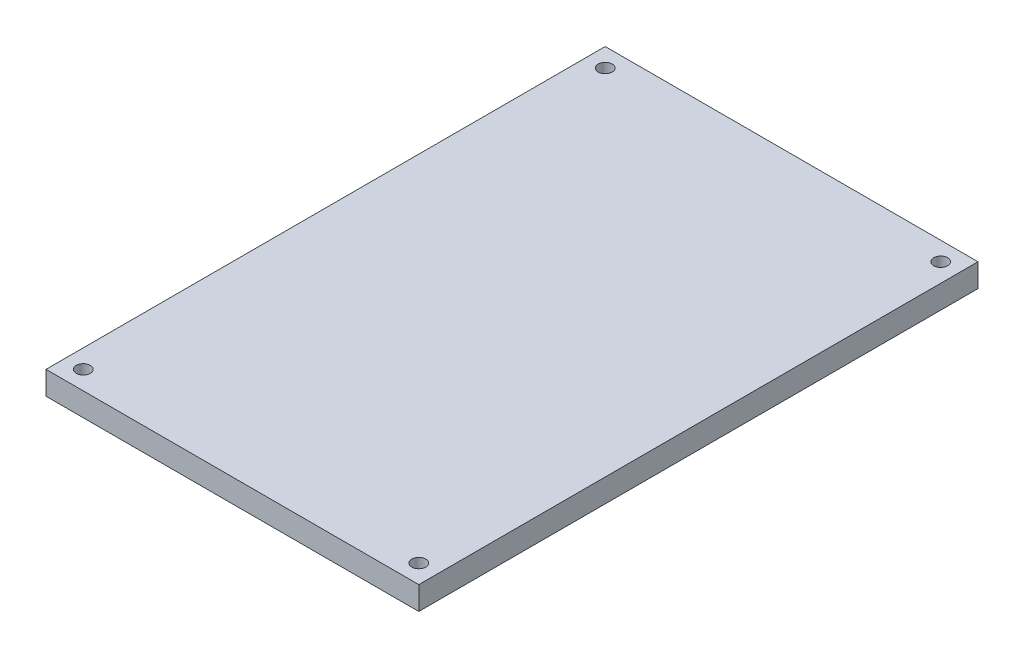
ISO-10303-21;
HEADER;
FILE_DESCRIPTION(('STEP AP214'),'2;1');
FILE_NAME('part.step','',(''),(''),'','','');
FILE_SCHEMA(('AUTOMOTIVE_DESIGN { 1 0 10303 214 1 1 1 1 }'));
ENDSEC;
DATA;
#1=APPLICATION_CONTEXT('core data for automotive mechanical design processes');
#2=APPLICATION_PROTOCOL_DEFINITION('international standard','automotive_design',2000,#1);
#3=PRODUCT_CONTEXT('',#1,'mechanical');
#4=PRODUCT('Part','Part','',(#3));
#5=PRODUCT_RELATED_PRODUCT_CATEGORY('part','',(#4));
#6=PRODUCT_DEFINITION_FORMATION('','',#4);
#7=PRODUCT_DEFINITION_CONTEXT('part definition',#1,'design');
#8=PRODUCT_DEFINITION('design','',#6,#7);
#9=PRODUCT_DEFINITION_SHAPE('','',#8);
#10=(LENGTH_UNIT() NAMED_UNIT(*) SI_UNIT(.MILLI.,.METRE.));
#11=(NAMED_UNIT(*) PLANE_ANGLE_UNIT() SI_UNIT($,.RADIAN.));
#12=(NAMED_UNIT(*) SI_UNIT($,.STERADIAN.) SOLID_ANGLE_UNIT());
#13=UNCERTAINTY_MEASURE_WITH_UNIT(LENGTH_MEASURE(1.E-05),#10,'distance_accuracy_value','');
#14=(GEOMETRIC_REPRESENTATION_CONTEXT(3) GLOBAL_UNCERTAINTY_ASSIGNED_CONTEXT((#13)) GLOBAL_UNIT_ASSIGNED_CONTEXT((#10,
#11,#12)) REPRESENTATION_CONTEXT('',''));
#15=CARTESIAN_POINT('',(0.,0.,0.));
#16=DIRECTION('',(0.,0.,1.));
#17=DIRECTION('',(1.,0.,0.));
#18=AXIS2_PLACEMENT_3D('',#15,#16,#17);
#19=CARTESIAN_POINT('',(0.,5.,0.));
#20=DIRECTION('',(0.,1.,0.));
#21=DIRECTION('',(0.,0.,1.));
#22=AXIS2_PLACEMENT_3D('',#19,#20,#21);
#23=PLANE('',#22);
#24=CARTESIAN_POINT('',(-76.,5.,-4.));
#25=DIRECTION('',(0.,-1.,0.));
#26=DIRECTION('',(0.,0.,-1.));
#27=AXIS2_PLACEMENT_3D('',#24,#25,#26);
#28=CIRCLE('',#27,1.5);
#29=CARTESIAN_POINT('',(-76.,5.,-5.5));
#30=VERTEX_POINT('',#29);
#31=EDGE_CURVE('E124',#30,#30,#28,.T.);
#32=ORIENTED_EDGE('',*,*,#31,.T.);
#33=EDGE_LOOP('',(#32));
#34=FACE_BOUND('',#33,.T.);
#35=CARTESIAN_POINT('',(-4.,5.,-116.));
#36=DIRECTION('',(0.,1.,0.));
#37=DIRECTION('',(0.,0.,1.));
#38=AXIS2_PLACEMENT_3D('',#35,#36,#37);
#39=CIRCLE('',#38,1.5);
#40=CARTESIAN_POINT('',(-4.,5.,-114.5));
#41=VERTEX_POINT('',#40);
#42=EDGE_CURVE('E118',#41,#41,#39,.T.);
#43=ORIENTED_EDGE('',*,*,#42,.F.);
#44=EDGE_LOOP('',(#43));
#45=FACE_BOUND('',#44,.T.);
#46=CARTESIAN_POINT('',(-76.,5.,-116.));
#47=DIRECTION('',(0.,1.,0.));
#48=DIRECTION('',(0.,0.,1.));
#49=AXIS2_PLACEMENT_3D('',#46,#47,#48);
#50=CIRCLE('',#49,1.5);
#51=CARTESIAN_POINT('',(-76.,5.,-114.5));
#52=VERTEX_POINT('',#51);
#53=EDGE_CURVE('E112',#52,#52,#50,.T.);
#54=ORIENTED_EDGE('',*,*,#53,.F.);
#55=EDGE_LOOP('',(#54));
#56=FACE_BOUND('',#55,.T.);
#57=DIRECTION('',(0.,0.,-1.));
#58=VECTOR('',#57,1.);
#59=CARTESIAN_POINT('',(0.,5.,0.));
#60=LINE('',#59,#58);
#61=CARTESIAN_POINT('',(0.,5.,0.));
#62=VERTEX_POINT('',#61);
#63=CARTESIAN_POINT('',(0.,5.,-120.));
#64=VERTEX_POINT('',#63);
#65=EDGE_CURVE('E85',#62,#64,#60,.T.);
#66=ORIENTED_EDGE('',*,*,#65,.T.);
#67=DIRECTION('',(-1.,0.,0.));
#68=VECTOR('',#67,1.);
#69=CARTESIAN_POINT('',(0.,5.,-120.));
#70=LINE('',#69,#68);
#71=CARTESIAN_POINT('',(-80.,5.,-120.));
#72=VERTEX_POINT('',#71);
#73=EDGE_CURVE('E80',#64,#72,#70,.T.);
#74=ORIENTED_EDGE('',*,*,#73,.T.);
#75=DIRECTION('',(0.,0.,1.));
#76=VECTOR('',#75,1.);
#77=CARTESIAN_POINT('',(-80.,5.,0.));
#78=LINE('',#77,#76);
#79=CARTESIAN_POINT('',(-80.,5.,0.));
#80=VERTEX_POINT('',#79);
#81=EDGE_CURVE('E83',#72,#80,#78,.T.);
#82=ORIENTED_EDGE('',*,*,#81,.T.);
#83=DIRECTION('',(1.,0.,0.));
#84=VECTOR('',#83,1.);
#85=CARTESIAN_POINT('',(0.,5.,0.));
#86=LINE('',#85,#84);
#87=EDGE_CURVE('E50',#80,#62,#86,.T.);
#88=ORIENTED_EDGE('',*,*,#87,.T.);
#89=EDGE_LOOP('',(#66,#74,#82,#88));
#90=FACE_BOUND('',#89,.T.);
#91=CARTESIAN_POINT('',(-4.,5.,-4.));
#92=DIRECTION('',(0.,-1.,0.));
#93=DIRECTION('',(0.,0.,-1.));
#94=AXIS2_PLACEMENT_3D('',#91,#92,#93);
#95=CIRCLE('',#94,1.5);
#96=CARTESIAN_POINT('',(-4.,5.,-5.50000000000001));
#97=VERTEX_POINT('',#96);
#98=EDGE_CURVE('E130',#97,#97,#95,.T.);
#99=ORIENTED_EDGE('',*,*,#98,.T.);
#100=EDGE_LOOP('',(#99));
#101=FACE_BOUND('',#100,.T.);
#102=ADVANCED_FACE('F33',(#34,#45,#56,#90,#101),#23,.T.);
#103=CARTESIAN_POINT('',(0.,0.,0.));
#104=DIRECTION('',(0.,1.,0.));
#105=DIRECTION('',(0.,0.,1.));
#106=AXIS2_PLACEMENT_3D('',#103,#104,#105);
#107=PLANE('',#106);
#108=CARTESIAN_POINT('',(-76.,0.,-4.));
#109=DIRECTION('',(0.,-1.,0.));
#110=DIRECTION('',(0.,0.,-1.));
#111=AXIS2_PLACEMENT_3D('',#108,#109,#110);
#112=CIRCLE('',#111,1.5);
#113=CARTESIAN_POINT('',(-76.,0.,-5.5));
#114=VERTEX_POINT('',#113);
#115=EDGE_CURVE('E121',#114,#114,#112,.T.);
#116=ORIENTED_EDGE('',*,*,#115,.F.);
#117=EDGE_LOOP('',(#116));
#118=FACE_BOUND('',#117,.T.);
#119=CARTESIAN_POINT('',(-4.,0.,-116.));
#120=DIRECTION('',(0.,1.,0.));
#121=DIRECTION('',(0.,0.,1.));
#122=AXIS2_PLACEMENT_3D('',#119,#120,#121);
#123=CIRCLE('',#122,1.5);
#124=CARTESIAN_POINT('',(-4.,0.,-114.5));
#125=VERTEX_POINT('',#124);
#126=EDGE_CURVE('E115',#125,#125,#123,.T.);
#127=ORIENTED_EDGE('',*,*,#126,.T.);
#128=EDGE_LOOP('',(#127));
#129=FACE_BOUND('',#128,.T.);
#130=CARTESIAN_POINT('',(-76.,0.,-116.));
#131=DIRECTION('',(0.,1.,0.));
#132=DIRECTION('',(0.,0.,1.));
#133=AXIS2_PLACEMENT_3D('',#130,#131,#132);
#134=CIRCLE('',#133,1.5);
#135=CARTESIAN_POINT('',(-76.,0.,-114.5));
#136=VERTEX_POINT('',#135);
#137=EDGE_CURVE('E100',#136,#136,#134,.T.);
#138=ORIENTED_EDGE('',*,*,#137,.T.);
#139=EDGE_LOOP('',(#138));
#140=FACE_BOUND('',#139,.T.);
#141=DIRECTION('',(0.,0.,-1.));
#142=VECTOR('',#141,1.);
#143=CARTESIAN_POINT('',(0.,0.,0.));
#144=LINE('',#143,#142);
#145=CARTESIAN_POINT('',(0.,0.,0.));
#146=VERTEX_POINT('',#145);
#147=CARTESIAN_POINT('',(0.,0.,-120.));
#148=VERTEX_POINT('',#147);
#149=EDGE_CURVE('E97',#146,#148,#144,.T.);
#150=ORIENTED_EDGE('',*,*,#149,.F.);
#151=DIRECTION('',(1.,0.,0.));
#152=VECTOR('',#151,1.);
#153=CARTESIAN_POINT('',(0.,0.,0.));
#154=LINE('',#153,#152);
#155=CARTESIAN_POINT('',(-80.,0.,0.));
#156=VERTEX_POINT('',#155);
#157=EDGE_CURVE('E73',#156,#146,#154,.T.);
#158=ORIENTED_EDGE('',*,*,#157,.F.);
#159=DIRECTION('',(0.,0.,1.));
#160=VECTOR('',#159,1.);
#161=CARTESIAN_POINT('',(-80.,0.,0.));
#162=LINE('',#161,#160);
#163=CARTESIAN_POINT('',(-80.,0.,-120.));
#164=VERTEX_POINT('',#163);
#165=EDGE_CURVE('E67',#164,#156,#162,.T.);
#166=ORIENTED_EDGE('',*,*,#165,.F.);
#167=DIRECTION('',(-1.,0.,0.));
#168=VECTOR('',#167,1.);
#169=CARTESIAN_POINT('',(0.,0.,-120.));
#170=LINE('',#169,#168);
#171=EDGE_CURVE('E89',#148,#164,#170,.T.);
#172=ORIENTED_EDGE('',*,*,#171,.F.);
#173=EDGE_LOOP('',(#150,#158,#166,#172));
#174=FACE_BOUND('',#173,.T.);
#175=CARTESIAN_POINT('',(-4.,0.,-4.));
#176=DIRECTION('',(0.,-1.,0.));
#177=DIRECTION('',(0.,0.,-1.));
#178=AXIS2_PLACEMENT_3D('',#175,#176,#177);
#179=CIRCLE('',#178,1.5);
#180=CARTESIAN_POINT('',(-4.,0.,-5.50000000000001));
#181=VERTEX_POINT('',#180);
#182=EDGE_CURVE('E127',#181,#181,#179,.T.);
#183=ORIENTED_EDGE('',*,*,#182,.F.);
#184=EDGE_LOOP('',(#183));
#185=FACE_BOUND('',#184,.T.);
#186=ADVANCED_FACE('F108',(#118,#129,#140,#174,#185),#107,.F.);
#187=CARTESIAN_POINT('',(0.,5.,0.));
#188=DIRECTION('',(-1.,0.,0.));
#189=DIRECTION('',(0.,0.,1.));
#190=AXIS2_PLACEMENT_3D('',#187,#188,#189);
#191=PLANE('',#190);
#192=ORIENTED_EDGE('',*,*,#149,.T.);
#193=DIRECTION('',(0.,-1.,0.));
#194=VECTOR('',#193,1.);
#195=CARTESIAN_POINT('',(0.,5.,-120.));
#196=LINE('',#195,#194);
#197=EDGE_CURVE('E11',#64,#148,#196,.T.);
#198=ORIENTED_EDGE('',*,*,#197,.F.);
#199=ORIENTED_EDGE('',*,*,#65,.F.);
#200=DIRECTION('',(0.,-1.,0.));
#201=VECTOR('',#200,1.);
#202=CARTESIAN_POINT('',(0.,5.,0.));
#203=LINE('',#202,#201);
#204=EDGE_CURVE('E93',#62,#146,#203,.T.);
#205=ORIENTED_EDGE('',*,*,#204,.T.);
#206=EDGE_LOOP('',(#192,#198,#199,#205));
#207=FACE_BOUND('',#206,.T.);
#208=ADVANCED_FACE('F35',(#207),#191,.F.);
#209=CARTESIAN_POINT('',(0.,5.,-120.));
#210=DIRECTION('',(0.,0.,1.));
#211=DIRECTION('',(1.,0.,0.));
#212=AXIS2_PLACEMENT_3D('',#209,#210,#211);
#213=PLANE('',#212);
#214=ORIENTED_EDGE('',*,*,#171,.T.);
#215=DIRECTION('',(0.,-1.,0.));
#216=VECTOR('',#215,1.);
#217=CARTESIAN_POINT('',(-80.,5.,-120.));
#218=LINE('',#217,#216);
#219=EDGE_CURVE('E42',#72,#164,#218,.T.);
#220=ORIENTED_EDGE('',*,*,#219,.F.);
#221=ORIENTED_EDGE('',*,*,#73,.F.);
#222=ORIENTED_EDGE('',*,*,#197,.T.);
#223=EDGE_LOOP('',(#214,#220,#221,#222));
#224=FACE_BOUND('',#223,.T.);
#225=ADVANCED_FACE('F88',(#224),#213,.F.);
#226=CARTESIAN_POINT('',(-80.,5.,0.));
#227=DIRECTION('',(1.,0.,0.));
#228=DIRECTION('',(0.,0.,-1.));
#229=AXIS2_PLACEMENT_3D('',#226,#227,#228);
#230=PLANE('',#229);
#231=ORIENTED_EDGE('',*,*,#165,.T.);
#232=DIRECTION('',(0.,-1.,0.));
#233=VECTOR('',#232,1.);
#234=CARTESIAN_POINT('',(-80.,5.,0.));
#235=LINE('',#234,#233);
#236=EDGE_CURVE('E90',#80,#156,#235,.T.);
#237=ORIENTED_EDGE('',*,*,#236,.F.);
#238=ORIENTED_EDGE('',*,*,#81,.F.);
#239=ORIENTED_EDGE('',*,*,#219,.T.);
#240=EDGE_LOOP('',(#231,#237,#238,#239));
#241=FACE_BOUND('',#240,.T.);
#242=ADVANCED_FACE('F91',(#241),#230,.F.);
#243=CARTESIAN_POINT('',(0.,5.,0.));
#244=DIRECTION('',(0.,0.,-1.));
#245=DIRECTION('',(-1.,0.,0.));
#246=AXIS2_PLACEMENT_3D('',#243,#244,#245);
#247=PLANE('',#246);
#248=ORIENTED_EDGE('',*,*,#157,.T.);
#249=ORIENTED_EDGE('',*,*,#204,.F.);
#250=ORIENTED_EDGE('',*,*,#87,.F.);
#251=ORIENTED_EDGE('',*,*,#236,.T.);
#252=EDGE_LOOP('',(#248,#249,#250,#251));
#253=FACE_BOUND('',#252,.T.);
#254=ADVANCED_FACE('F105',(#253),#247,.F.);
#255=CARTESIAN_POINT('',(-76.,0.,-116.));
#256=DIRECTION('',(0.,1.,0.));
#257=DIRECTION('',(0.,0.,1.));
#258=AXIS2_PLACEMENT_3D('',#255,#256,#257);
#259=CYLINDRICAL_SURFACE('',#258,1.5);
#260=ORIENTED_EDGE('',*,*,#137,.F.);
#261=EDGE_LOOP('',(#260));
#262=FACE_BOUND('',#261,.T.);
#263=ORIENTED_EDGE('',*,*,#53,.T.);
#264=EDGE_LOOP('',(#263));
#265=FACE_BOUND('',#264,.T.);
#266=ADVANCED_FACE('F153',(#262,#265),#259,.F.);
#267=CARTESIAN_POINT('',(-4.,0.,-116.));
#268=DIRECTION('',(0.,1.,0.));
#269=DIRECTION('',(0.,0.,1.));
#270=AXIS2_PLACEMENT_3D('',#267,#268,#269);
#271=CYLINDRICAL_SURFACE('',#270,1.5);
#272=ORIENTED_EDGE('',*,*,#126,.F.);
#273=EDGE_LOOP('',(#272));
#274=FACE_BOUND('',#273,.T.);
#275=ORIENTED_EDGE('',*,*,#42,.T.);
#276=EDGE_LOOP('',(#275));
#277=FACE_BOUND('',#276,.T.);
#278=ADVANCED_FACE('F174',(#274,#277),#271,.F.);
#279=CARTESIAN_POINT('',(-76.,0.,-4.));
#280=DIRECTION('',(0.,1.,0.));
#281=DIRECTION('',(0.,0.,1.));
#282=AXIS2_PLACEMENT_3D('',#279,#280,#281);
#283=CYLINDRICAL_SURFACE('',#282,1.5);
#284=ORIENTED_EDGE('',*,*,#115,.T.);
#285=EDGE_LOOP('',(#284));
#286=FACE_BOUND('',#285,.T.);
#287=ORIENTED_EDGE('',*,*,#31,.F.);
#288=EDGE_LOOP('',(#287));
#289=FACE_BOUND('',#288,.T.);
#290=ADVANCED_FACE('F181',(#286,#289),#283,.F.);
#291=CARTESIAN_POINT('',(-4.,0.,-4.));
#292=DIRECTION('',(0.,1.,0.));
#293=DIRECTION('',(0.,0.,1.));
#294=AXIS2_PLACEMENT_3D('',#291,#292,#293);
#295=CYLINDRICAL_SURFACE('',#294,1.5);
#296=ORIENTED_EDGE('',*,*,#182,.T.);
#297=EDGE_LOOP('',(#296));
#298=FACE_BOUND('',#297,.T.);
#299=ORIENTED_EDGE('',*,*,#98,.F.);
#300=EDGE_LOOP('',(#299));
#301=FACE_BOUND('',#300,.T.);
#302=ADVANCED_FACE('F136',(#298,#301),#295,.F.);
#303=CLOSED_SHELL('',(#102,#186,#208,#225,#242,#254,#266,#278,#290,#302));
#304=MANIFOLD_SOLID_BREP('B2',#303);
#305=ADVANCED_BREP_SHAPE_REPRESENTATION('',(#18,#304),#14);
#306=SHAPE_DEFINITION_REPRESENTATION(#9,#305);
ENDSEC;
END-ISO-10303-21;
